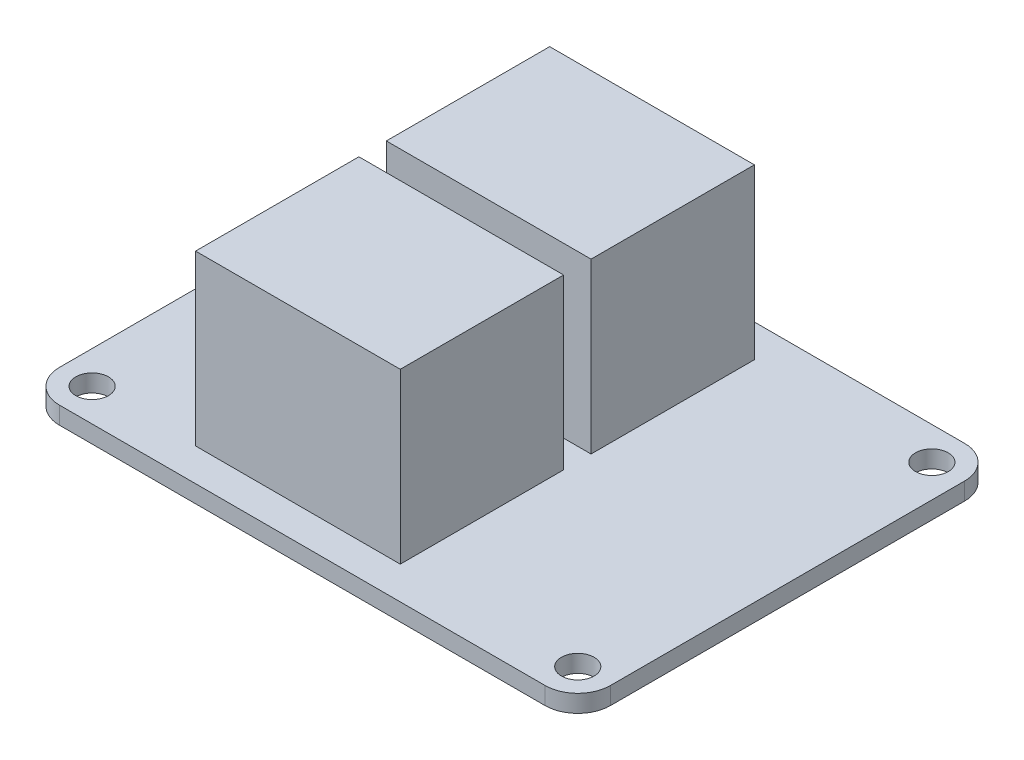
ISO-10303-21;
HEADER;
FILE_DESCRIPTION(('STEP AP214'),'2;1');
FILE_NAME('part.step','',(''),(''),'','','');
FILE_SCHEMA(('AUTOMOTIVE_DESIGN { 1 0 10303 214 1 1 1 1 }'));
ENDSEC;
DATA;
#1=APPLICATION_CONTEXT('core data for automotive mechanical design processes');
#2=APPLICATION_PROTOCOL_DEFINITION('international standard','automotive_design',2000,#1);
#3=PRODUCT_CONTEXT('',#1,'mechanical');
#4=PRODUCT('Part','Part','',(#3));
#5=PRODUCT_RELATED_PRODUCT_CATEGORY('part','',(#4));
#6=PRODUCT_DEFINITION_FORMATION('','',#4);
#7=PRODUCT_DEFINITION_CONTEXT('part definition',#1,'design');
#8=PRODUCT_DEFINITION('design','',#6,#7);
#9=PRODUCT_DEFINITION_SHAPE('','',#8);
#10=(LENGTH_UNIT() NAMED_UNIT(*) SI_UNIT(.MILLI.,.METRE.));
#11=(NAMED_UNIT(*) PLANE_ANGLE_UNIT() SI_UNIT($,.RADIAN.));
#12=(NAMED_UNIT(*) SI_UNIT($,.STERADIAN.) SOLID_ANGLE_UNIT());
#13=UNCERTAINTY_MEASURE_WITH_UNIT(LENGTH_MEASURE(1.E-05),#10,'distance_accuracy_value','');
#14=(GEOMETRIC_REPRESENTATION_CONTEXT(3) GLOBAL_UNCERTAINTY_ASSIGNED_CONTEXT((#13)) GLOBAL_UNIT_ASSIGNED_CONTEXT((#10,
#11,#12)) REPRESENTATION_CONTEXT('',''));
#15=CARTESIAN_POINT('',(0.,0.,0.));
#16=DIRECTION('',(0.,0.,1.));
#17=DIRECTION('',(1.,0.,0.));
#18=AXIS2_PLACEMENT_3D('',#15,#16,#17);
#19=CARTESIAN_POINT('',(0.,1.6,0.));
#20=DIRECTION('',(0.,1.,0.));
#21=DIRECTION('',(0.,0.,1.));
#22=AXIS2_PLACEMENT_3D('',#19,#20,#21);
#23=PLANE('',#22);
#24=DIRECTION('',(1.,0.,0.));
#25=VECTOR('',#24,1.);
#26=CARTESIAN_POINT('',(-21.1899742930591,1.6,2.84601542416452));
#27=LINE('',#26,#25);
#28=CARTESIAN_POINT('',(-21.1899742930591,1.6,2.84601542416452));
#29=VERTEX_POINT('',#28);
#30=CARTESIAN_POINT('',(-2.38997429305913,1.6,2.84601542416452));
#31=VERTEX_POINT('',#30);
#32=EDGE_CURVE('E174',#29,#31,#27,.T.);
#33=ORIENTED_EDGE('',*,*,#32,.F.);
#34=DIRECTION('',(0.,0.,1.));
#35=VECTOR('',#34,1.);
#36=CARTESIAN_POINT('',(-21.1899742930591,1.6,-12.1539845758355));
#37=LINE('',#36,#35);
#38=CARTESIAN_POINT('',(-21.1899742930591,1.6,-12.1539845758355));
#39=VERTEX_POINT('',#38);
#40=EDGE_CURVE('E171',#39,#29,#37,.T.);
#41=ORIENTED_EDGE('',*,*,#40,.F.);
#42=DIRECTION('',(-1.,0.,0.));
#43=VECTOR('',#42,1.);
#44=CARTESIAN_POINT('',(-21.1899742930591,1.6,-12.1539845758355));
#45=LINE('',#44,#43);
#46=CARTESIAN_POINT('',(-2.38997429305913,1.6,-12.1539845758355));
#47=VERTEX_POINT('',#46);
#48=EDGE_CURVE('E183',#47,#39,#45,.T.);
#49=ORIENTED_EDGE('',*,*,#48,.F.);
#50=DIRECTION('',(0.,0.,-1.));
#51=VECTOR('',#50,1.);
#52=CARTESIAN_POINT('',(-2.38997429305913,1.6,-12.1539845758355));
#53=LINE('',#52,#51);
#54=EDGE_CURVE('E191',#31,#47,#53,.T.);
#55=ORIENTED_EDGE('',*,*,#54,.F.);
#56=EDGE_LOOP('',(#33,#41,#49,#55));
#57=FACE_BOUND('',#56,.T.);
#58=CARTESIAN_POINT('',(-30.6899742930591,1.6,20.3660154241645));
#59=DIRECTION('',(0.,1.,0.));
#60=DIRECTION('',(0.,0.,1.));
#61=AXIS2_PLACEMENT_3D('',#58,#59,#60);
#62=CIRCLE('',#61,1.5);
#63=CARTESIAN_POINT('',(-30.6899742930591,1.6,21.8660154241645));
#64=VERTEX_POINT('',#63);
#65=EDGE_CURVE('E209',#64,#64,#62,.T.);
#66=ORIENTED_EDGE('',*,*,#65,.F.);
#67=EDGE_LOOP('',(#66));
#68=FACE_BOUND('',#67,.T.);
#69=CARTESIAN_POINT('',(13.9100257069409,1.6,-12.1539845758355));
#70=DIRECTION('',(0.,1.,0.));
#71=DIRECTION('',(0.,0.,1.));
#72=AXIS2_PLACEMENT_3D('',#69,#70,#71);
#73=CIRCLE('',#72,1.5);
#74=CARTESIAN_POINT('',(13.9100257069409,1.6,-10.6539845758355));
#75=VERTEX_POINT('',#74);
#76=EDGE_CURVE('E221',#75,#75,#73,.T.);
#77=ORIENTED_EDGE('',*,*,#76,.F.);
#78=EDGE_LOOP('',(#77));
#79=FACE_BOUND('',#78,.T.);
#80=DIRECTION('',(1.,0.,0.));
#81=VECTOR('',#80,1.);
#82=CARTESIAN_POINT('',(-33.6899742930591,1.6,23.3660154241645));
#83=LINE('',#82,#81);
#84=CARTESIAN_POINT('',(-30.6899742930591,1.6,23.3660154241645));
#85=VERTEX_POINT('',#84);
#86=CARTESIAN_POINT('',(13.9100257069409,1.6,23.3660154241645));
#87=VERTEX_POINT('',#86);
#88=EDGE_CURVE('E230',#85,#87,#83,.T.);
#89=ORIENTED_EDGE('',*,*,#88,.T.);
#90=CARTESIAN_POINT('',(13.9100257069409,1.6,20.3660154241645));
#91=DIRECTION('',(0.,1.,0.));
#92=DIRECTION('',(0.,0.,1.));
#93=AXIS2_PLACEMENT_3D('',#90,#91,#92);
#94=CIRCLE('',#93,3.);
#95=CARTESIAN_POINT('',(16.9100257069409,1.6,20.3660154241645));
#96=VERTEX_POINT('',#95);
#97=EDGE_CURVE('E11',#87,#96,#94,.T.);
#98=ORIENTED_EDGE('',*,*,#97,.T.);
#99=DIRECTION('',(0.,0.,-1.));
#100=VECTOR('',#99,1.);
#101=CARTESIAN_POINT('',(16.9100257069409,1.6,-15.1539845758355));
#102=LINE('',#101,#100);
#103=CARTESIAN_POINT('',(16.9100257069409,1.6,-12.1539845758355));
#104=VERTEX_POINT('',#103);
#105=EDGE_CURVE('E234',#96,#104,#102,.T.);
#106=ORIENTED_EDGE('',*,*,#105,.T.);
#107=CARTESIAN_POINT('',(13.9100257069409,1.6,-12.1539845758355));
#108=DIRECTION('',(0.,1.,0.));
#109=DIRECTION('',(0.,0.,1.));
#110=AXIS2_PLACEMENT_3D('',#107,#108,#109);
#111=CIRCLE('',#110,3.);
#112=CARTESIAN_POINT('',(13.9100257069409,1.6,-15.1539845758355));
#113=VERTEX_POINT('',#112);
#114=EDGE_CURVE('E257',#104,#113,#111,.T.);
#115=ORIENTED_EDGE('',*,*,#114,.T.);
#116=DIRECTION('',(-1.,0.,0.));
#117=VECTOR('',#116,1.);
#118=CARTESIAN_POINT('',(-33.6899742930591,1.6,-15.1539845758355));
#119=LINE('',#118,#117);
#120=CARTESIAN_POINT('',(-30.6899742930591,1.6,-15.1539845758355));
#121=VERTEX_POINT('',#120);
#122=EDGE_CURVE('E236',#113,#121,#119,.T.);
#123=ORIENTED_EDGE('',*,*,#122,.T.);
#124=CARTESIAN_POINT('',(-30.6899742930591,1.6,-12.1539845758355));
#125=DIRECTION('',(0.,1.,0.));
#126=DIRECTION('',(0.,0.,1.));
#127=AXIS2_PLACEMENT_3D('',#124,#125,#126);
#128=CIRCLE('',#127,3.);
#129=CARTESIAN_POINT('',(-33.6899742930591,1.6,-12.1539845758355));
#130=VERTEX_POINT('',#129);
#131=EDGE_CURVE('E266',#121,#130,#128,.T.);
#132=ORIENTED_EDGE('',*,*,#131,.T.);
#133=DIRECTION('',(0.,0.,1.));
#134=VECTOR('',#133,1.);
#135=CARTESIAN_POINT('',(-33.6899742930591,1.6,-15.1539845758355));
#136=LINE('',#135,#134);
#137=CARTESIAN_POINT('',(-33.6899742930591,1.6,20.3660154241645));
#138=VERTEX_POINT('',#137);
#139=EDGE_CURVE('E227',#130,#138,#136,.T.);
#140=ORIENTED_EDGE('',*,*,#139,.T.);
#141=CARTESIAN_POINT('',(-30.6899742930591,1.6,20.3660154241645));
#142=DIRECTION('',(0.,1.,0.));
#143=DIRECTION('',(0.,0.,1.));
#144=AXIS2_PLACEMENT_3D('',#141,#142,#143);
#145=CIRCLE('',#144,3.);
#146=EDGE_CURVE('E275',#138,#85,#145,.T.);
#147=ORIENTED_EDGE('',*,*,#146,.T.);
#148=EDGE_LOOP('',(#89,#98,#106,#115,#123,#132,#140,#147));
#149=FACE_BOUND('',#148,.T.);
#150=CARTESIAN_POINT('',(13.9100257069409,1.6,20.3660154241645));
#151=DIRECTION('',(0.,1.,0.));
#152=DIRECTION('',(0.,0.,1.));
#153=AXIS2_PLACEMENT_3D('',#150,#151,#152);
#154=CIRCLE('',#153,1.5);
#155=CARTESIAN_POINT('',(13.9100257069409,1.6,21.8660154241645));
#156=VERTEX_POINT('',#155);
#157=EDGE_CURVE('E215',#156,#156,#154,.T.);
#158=ORIENTED_EDGE('',*,*,#157,.F.);
#159=EDGE_LOOP('',(#158));
#160=FACE_BOUND('',#159,.T.);
#161=CARTESIAN_POINT('',(-30.6899742930591,1.6,-12.1539845758355));
#162=DIRECTION('',(0.,1.,0.));
#163=DIRECTION('',(0.,0.,1.));
#164=AXIS2_PLACEMENT_3D('',#161,#162,#163);
#165=CIRCLE('',#164,1.5);
#166=CARTESIAN_POINT('',(-30.6899742930591,1.6,-10.6539845758355));
#167=VERTEX_POINT('',#166);
#168=EDGE_CURVE('E203',#167,#167,#165,.T.);
#169=ORIENTED_EDGE('',*,*,#168,.F.);
#170=EDGE_LOOP('',(#169));
#171=FACE_BOUND('',#170,.T.);
#172=DIRECTION('',(1.,0.,0.));
#173=VECTOR('',#172,1.);
#174=CARTESIAN_POINT('',(-21.1899742930591,1.6,20.3660154241645));
#175=LINE('',#174,#173);
#176=CARTESIAN_POINT('',(-21.1899742930591,1.6,20.3660154241645));
#177=VERTEX_POINT('',#176);
#178=CARTESIAN_POINT('',(-2.38997429305913,1.6,20.3660154241645));
#179=VERTEX_POINT('',#178);
#180=EDGE_CURVE('E382',#177,#179,#175,.T.);
#181=ORIENTED_EDGE('',*,*,#180,.F.);
#182=DIRECTION('',(0.,0.,1.));
#183=VECTOR('',#182,1.);
#184=CARTESIAN_POINT('',(-21.1899742930591,1.6,5.36601542416453));
#185=LINE('',#184,#183);
#186=CARTESIAN_POINT('',(-21.1899742930591,1.6,5.36601542416453));
#187=VERTEX_POINT('',#186);
#188=EDGE_CURVE('E169',#187,#177,#185,.T.);
#189=ORIENTED_EDGE('',*,*,#188,.F.);
#190=DIRECTION('',(-1.,0.,0.));
#191=VECTOR('',#190,1.);
#192=CARTESIAN_POINT('',(-21.1899742930591,1.6,5.36601542416453));
#193=LINE('',#192,#191);
#194=CARTESIAN_POINT('',(-2.38997429305913,1.6,5.36601542416453));
#195=VERTEX_POINT('',#194);
#196=EDGE_CURVE('E165',#195,#187,#193,.T.);
#197=ORIENTED_EDGE('',*,*,#196,.F.);
#198=DIRECTION('',(0.,0.,-1.));
#199=VECTOR('',#198,1.);
#200=CARTESIAN_POINT('',(-2.38997429305913,1.6,5.36601542416453));
#201=LINE('',#200,#199);
#202=EDGE_CURVE('E384',#179,#195,#201,.T.);
#203=ORIENTED_EDGE('',*,*,#202,.F.);
#204=EDGE_LOOP('',(#181,#189,#197,#203));
#205=FACE_BOUND('',#204,.T.);
#206=ADVANCED_FACE('F33',(#57,#68,#79,#149,#160,#171,#205),#23,.T.);
#207=CARTESIAN_POINT('',(0.,0.,0.));
#208=DIRECTION('',(0.,1.,0.));
#209=DIRECTION('',(0.,0.,1.));
#210=AXIS2_PLACEMENT_3D('',#207,#208,#209);
#211=PLANE('',#210);
#212=CARTESIAN_POINT('',(-30.6899742930591,0.,20.3660154241645));
#213=DIRECTION('',(0.,1.,0.));
#214=DIRECTION('',(0.,0.,1.));
#215=AXIS2_PLACEMENT_3D('',#212,#213,#214);
#216=CIRCLE('',#215,1.5);
#217=CARTESIAN_POINT('',(-30.6899742930591,0.,21.8660154241645));
#218=VERTEX_POINT('',#217);
#219=EDGE_CURVE('E206',#218,#218,#216,.T.);
#220=ORIENTED_EDGE('',*,*,#219,.T.);
#221=EDGE_LOOP('',(#220));
#222=FACE_BOUND('',#221,.T.);
#223=CARTESIAN_POINT('',(13.9100257069409,0.,-12.1539845758355));
#224=DIRECTION('',(0.,1.,0.));
#225=DIRECTION('',(0.,0.,1.));
#226=AXIS2_PLACEMENT_3D('',#223,#224,#225);
#227=CIRCLE('',#226,1.5);
#228=CARTESIAN_POINT('',(13.9100257069409,0.,-10.6539845758355));
#229=VERTEX_POINT('',#228);
#230=EDGE_CURVE('E218',#229,#229,#227,.T.);
#231=ORIENTED_EDGE('',*,*,#230,.T.);
#232=EDGE_LOOP('',(#231));
#233=FACE_BOUND('',#232,.T.);
#234=DIRECTION('',(0.,0.,-1.));
#235=VECTOR('',#234,1.);
#236=CARTESIAN_POINT('',(16.9100257069409,0.,-15.1539845758355));
#237=LINE('',#236,#235);
#238=CARTESIAN_POINT('',(16.9100257069409,0.,20.3660154241645));
#239=VERTEX_POINT('',#238);
#240=CARTESIAN_POINT('',(16.9100257069409,0.,-12.1539845758355));
#241=VERTEX_POINT('',#240);
#242=EDGE_CURVE('E245',#239,#241,#237,.T.);
#243=ORIENTED_EDGE('',*,*,#242,.F.);
#244=CARTESIAN_POINT('',(13.9100257069409,0.,20.3660154241645));
#245=DIRECTION('',(0.,1.,0.));
#246=DIRECTION('',(0.,0.,1.));
#247=AXIS2_PLACEMENT_3D('',#244,#245,#246);
#248=CIRCLE('',#247,3.);
#249=CARTESIAN_POINT('',(13.9100257069409,0.,23.3660154241645));
#250=VERTEX_POINT('',#249);
#251=EDGE_CURVE('E280',#239,#250,#248,.F.);
#252=ORIENTED_EDGE('',*,*,#251,.T.);
#253=DIRECTION('',(1.,0.,0.));
#254=VECTOR('',#253,1.);
#255=CARTESIAN_POINT('',(-33.6899742930591,0.,23.3660154241645));
#256=LINE('',#255,#254);
#257=CARTESIAN_POINT('',(-30.6899742930591,0.,23.3660154241645));
#258=VERTEX_POINT('',#257);
#259=EDGE_CURVE('E242',#258,#250,#256,.T.);
#260=ORIENTED_EDGE('',*,*,#259,.F.);
#261=CARTESIAN_POINT('',(-30.6899742930591,0.,20.3660154241645));
#262=DIRECTION('',(0.,1.,0.));
#263=DIRECTION('',(0.,0.,1.));
#264=AXIS2_PLACEMENT_3D('',#261,#262,#263);
#265=CIRCLE('',#264,3.);
#266=CARTESIAN_POINT('',(-33.6899742930591,0.,20.3660154241645));
#267=VERTEX_POINT('',#266);
#268=EDGE_CURVE('E271',#258,#267,#265,.F.);
#269=ORIENTED_EDGE('',*,*,#268,.T.);
#270=DIRECTION('',(0.,0.,1.));
#271=VECTOR('',#270,1.);
#272=CARTESIAN_POINT('',(-33.6899742930591,0.,-15.1539845758355));
#273=LINE('',#272,#271);
#274=CARTESIAN_POINT('',(-33.6899742930591,0.,-12.1539845758355));
#275=VERTEX_POINT('',#274);
#276=EDGE_CURVE('E224',#275,#267,#273,.T.);
#277=ORIENTED_EDGE('',*,*,#276,.F.);
#278=CARTESIAN_POINT('',(-30.6899742930591,0.,-12.1539845758355));
#279=DIRECTION('',(0.,1.,0.));
#280=DIRECTION('',(0.,0.,1.));
#281=AXIS2_PLACEMENT_3D('',#278,#279,#280);
#282=CIRCLE('',#281,3.);
#283=CARTESIAN_POINT('',(-30.6899742930591,0.,-15.1539845758355));
#284=VERTEX_POINT('',#283);
#285=EDGE_CURVE('E262',#275,#284,#282,.F.);
#286=ORIENTED_EDGE('',*,*,#285,.T.);
#287=DIRECTION('',(-1.,0.,0.));
#288=VECTOR('',#287,1.);
#289=CARTESIAN_POINT('',(-33.6899742930591,0.,-15.1539845758355));
#290=LINE('',#289,#288);
#291=CARTESIAN_POINT('',(13.9100257069409,0.,-15.1539845758355));
#292=VERTEX_POINT('',#291);
#293=EDGE_CURVE('E231',#292,#284,#290,.T.);
#294=ORIENTED_EDGE('',*,*,#293,.F.);
#295=CARTESIAN_POINT('',(13.9100257069409,0.,-12.1539845758355));
#296=DIRECTION('',(0.,1.,0.));
#297=DIRECTION('',(0.,0.,1.));
#298=AXIS2_PLACEMENT_3D('',#295,#296,#297);
#299=CIRCLE('',#298,3.);
#300=EDGE_CURVE('E251',#292,#241,#299,.F.);
#301=ORIENTED_EDGE('',*,*,#300,.T.);
#302=EDGE_LOOP('',(#243,#252,#260,#269,#277,#286,#294,#301));
#303=FACE_BOUND('',#302,.T.);
#304=CARTESIAN_POINT('',(13.9100257069409,0.,20.3660154241645));
#305=DIRECTION('',(0.,1.,0.));
#306=DIRECTION('',(0.,0.,1.));
#307=AXIS2_PLACEMENT_3D('',#304,#305,#306);
#308=CIRCLE('',#307,1.5);
#309=CARTESIAN_POINT('',(13.9100257069409,0.,21.8660154241645));
#310=VERTEX_POINT('',#309);
#311=EDGE_CURVE('E212',#310,#310,#308,.T.);
#312=ORIENTED_EDGE('',*,*,#311,.T.);
#313=EDGE_LOOP('',(#312));
#314=FACE_BOUND('',#313,.T.);
#315=CARTESIAN_POINT('',(-30.6899742930591,0.,-12.1539845758355));
#316=DIRECTION('',(0.,1.,0.));
#317=DIRECTION('',(0.,0.,1.));
#318=AXIS2_PLACEMENT_3D('',#315,#316,#317);
#319=CIRCLE('',#318,1.5);
#320=CARTESIAN_POINT('',(-30.6899742930591,0.,-10.6539845758355));
#321=VERTEX_POINT('',#320);
#322=EDGE_CURVE('E202',#321,#321,#319,.T.);
#323=ORIENTED_EDGE('',*,*,#322,.T.);
#324=EDGE_LOOP('',(#323));
#325=FACE_BOUND('',#324,.T.);
#326=ADVANCED_FACE('F298',(#222,#233,#303,#314,#325),#211,.F.);
#327=CARTESIAN_POINT('',(-33.6899742930591,1.6,-15.1539845758355));
#328=DIRECTION('',(1.,0.,0.));
#329=DIRECTION('',(0.,0.,-1.));
#330=AXIS2_PLACEMENT_3D('',#327,#328,#329);
#331=PLANE('',#330);
#332=ORIENTED_EDGE('',*,*,#276,.T.);
#333=DIRECTION('',(0.,-1.,0.));
#334=VECTOR('',#333,1.);
#335=CARTESIAN_POINT('',(-33.6899742930591,1.6,20.3660154241645));
#336=LINE('',#335,#334);
#337=EDGE_CURVE('E273',#267,#138,#336,.F.);
#338=ORIENTED_EDGE('',*,*,#337,.T.);
#339=ORIENTED_EDGE('',*,*,#139,.F.);
#340=DIRECTION('',(0.,-1.,0.));
#341=VECTOR('',#340,1.);
#342=CARTESIAN_POINT('',(-33.6899742930591,1.6,-12.1539845758355));
#343=LINE('',#342,#341);
#344=EDGE_CURVE('E259',#130,#275,#343,.T.);
#345=ORIENTED_EDGE('',*,*,#344,.T.);
#346=EDGE_LOOP('',(#332,#338,#339,#345));
#347=FACE_BOUND('',#346,.T.);
#348=ADVANCED_FACE('F316',(#347),#331,.F.);
#349=CARTESIAN_POINT('',(-33.6899742930591,1.6,23.3660154241645));
#350=DIRECTION('',(0.,0.,-1.));
#351=DIRECTION('',(-1.,0.,0.));
#352=AXIS2_PLACEMENT_3D('',#349,#350,#351);
#353=PLANE('',#352);
#354=ORIENTED_EDGE('',*,*,#259,.T.);
#355=DIRECTION('',(0.,-1.,0.));
#356=VECTOR('',#355,1.);
#357=CARTESIAN_POINT('',(13.9100257069409,1.6,23.3660154241645));
#358=LINE('',#357,#356);
#359=EDGE_CURVE('E41',#250,#87,#358,.F.);
#360=ORIENTED_EDGE('',*,*,#359,.T.);
#361=ORIENTED_EDGE('',*,*,#88,.F.);
#362=DIRECTION('',(0.,-1.,0.));
#363=VECTOR('',#362,1.);
#364=CARTESIAN_POINT('',(-30.6899742930591,1.6,23.3660154241645));
#365=LINE('',#364,#363);
#366=EDGE_CURVE('E268',#85,#258,#365,.T.);
#367=ORIENTED_EDGE('',*,*,#366,.T.);
#368=EDGE_LOOP('',(#354,#360,#361,#367));
#369=FACE_BOUND('',#368,.T.);
#370=ADVANCED_FACE('F284',(#369),#353,.F.);
#371=CARTESIAN_POINT('',(16.9100257069409,1.6,-15.1539845758355));
#372=DIRECTION('',(-1.,0.,0.));
#373=DIRECTION('',(0.,0.,1.));
#374=AXIS2_PLACEMENT_3D('',#371,#372,#373);
#375=PLANE('',#374);
#376=ORIENTED_EDGE('',*,*,#105,.F.);
#377=DIRECTION('',(0.,-1.,0.));
#378=VECTOR('',#377,1.);
#379=CARTESIAN_POINT('',(16.9100257069409,1.6,20.3660154241645));
#380=LINE('',#379,#378);
#381=EDGE_CURVE('E277',#96,#239,#380,.T.);
#382=ORIENTED_EDGE('',*,*,#381,.T.);
#383=ORIENTED_EDGE('',*,*,#242,.T.);
#384=DIRECTION('',(0.,-1.,0.));
#385=VECTOR('',#384,1.);
#386=CARTESIAN_POINT('',(16.9100257069409,1.6,-12.1539845758355));
#387=LINE('',#386,#385);
#388=EDGE_CURVE('E254',#241,#104,#387,.F.);
#389=ORIENTED_EDGE('',*,*,#388,.T.);
#390=EDGE_LOOP('',(#376,#382,#383,#389));
#391=FACE_BOUND('',#390,.T.);
#392=ADVANCED_FACE('F296',(#391),#375,.F.);
#393=CARTESIAN_POINT('',(-33.6899742930591,1.6,-15.1539845758355));
#394=DIRECTION('',(0.,0.,1.));
#395=DIRECTION('',(1.,0.,0.));
#396=AXIS2_PLACEMENT_3D('',#393,#394,#395);
#397=PLANE('',#396);
#398=ORIENTED_EDGE('',*,*,#293,.T.);
#399=DIRECTION('',(0.,-1.,0.));
#400=VECTOR('',#399,1.);
#401=CARTESIAN_POINT('',(-30.6899742930591,1.6,-15.1539845758355));
#402=LINE('',#401,#400);
#403=EDGE_CURVE('E264',#284,#121,#402,.F.);
#404=ORIENTED_EDGE('',*,*,#403,.T.);
#405=ORIENTED_EDGE('',*,*,#122,.F.);
#406=DIRECTION('',(0.,-1.,0.));
#407=VECTOR('',#406,1.);
#408=CARTESIAN_POINT('',(13.9100257069409,1.6,-15.1539845758355));
#409=LINE('',#408,#407);
#410=EDGE_CURVE('E239',#113,#292,#409,.T.);
#411=ORIENTED_EDGE('',*,*,#410,.T.);
#412=EDGE_LOOP('',(#398,#404,#405,#411));
#413=FACE_BOUND('',#412,.T.);
#414=ADVANCED_FACE('F309',(#413),#397,.F.);
#415=CARTESIAN_POINT('',(13.9100257069409,1.6,-12.1539845758355));
#416=DIRECTION('',(0.,-1.,0.));
#417=DIRECTION('',(0.,0.,-1.));
#418=AXIS2_PLACEMENT_3D('',#415,#416,#417);
#419=CYLINDRICAL_SURFACE('',#418,1.5);
#420=ORIENTED_EDGE('',*,*,#76,.T.);
#421=EDGE_LOOP('',(#420));
#422=FACE_BOUND('',#421,.T.);
#423=ORIENTED_EDGE('',*,*,#230,.F.);
#424=EDGE_LOOP('',(#423));
#425=FACE_BOUND('',#424,.T.);
#426=ADVANCED_FACE('F339',(#422,#425),#419,.F.);
#427=CARTESIAN_POINT('',(13.9100257069409,1.6,20.3660154241645));
#428=DIRECTION('',(0.,-1.,0.));
#429=DIRECTION('',(0.,0.,-1.));
#430=AXIS2_PLACEMENT_3D('',#427,#428,#429);
#431=CYLINDRICAL_SURFACE('',#430,1.5);
#432=ORIENTED_EDGE('',*,*,#157,.T.);
#433=EDGE_LOOP('',(#432));
#434=FACE_BOUND('',#433,.T.);
#435=ORIENTED_EDGE('',*,*,#311,.F.);
#436=EDGE_LOOP('',(#435));
#437=FACE_BOUND('',#436,.T.);
#438=ADVANCED_FACE('F361',(#434,#437),#431,.F.);
#439=CARTESIAN_POINT('',(-30.6899742930591,1.6,20.3660154241645));
#440=DIRECTION('',(0.,-1.,0.));
#441=DIRECTION('',(0.,0.,-1.));
#442=AXIS2_PLACEMENT_3D('',#439,#440,#441);
#443=CYLINDRICAL_SURFACE('',#442,1.5);
#444=ORIENTED_EDGE('',*,*,#65,.T.);
#445=EDGE_LOOP('',(#444));
#446=FACE_BOUND('',#445,.T.);
#447=ORIENTED_EDGE('',*,*,#219,.F.);
#448=EDGE_LOOP('',(#447));
#449=FACE_BOUND('',#448,.T.);
#450=ADVANCED_FACE('F355',(#446,#449),#443,.F.);
#451=CARTESIAN_POINT('',(-30.6899742930591,1.6,-12.1539845758355));
#452=DIRECTION('',(0.,-1.,0.));
#453=DIRECTION('',(0.,0.,-1.));
#454=AXIS2_PLACEMENT_3D('',#451,#452,#453);
#455=CYLINDRICAL_SURFACE('',#454,1.5);
#456=ORIENTED_EDGE('',*,*,#168,.T.);
#457=EDGE_LOOP('',(#456));
#458=FACE_BOUND('',#457,.T.);
#459=ORIENTED_EDGE('',*,*,#322,.F.);
#460=EDGE_LOOP('',(#459));
#461=FACE_BOUND('',#460,.T.);
#462=ADVANCED_FACE('F351',(#458,#461),#455,.F.);
#463=CARTESIAN_POINT('',(13.9100257069409,1.6,-12.1539845758355));
#464=DIRECTION('',(0.,-1.,0.));
#465=DIRECTION('',(0.,0.,-1.));
#466=AXIS2_PLACEMENT_3D('',#463,#464,#465);
#467=CYLINDRICAL_SURFACE('',#466,3.);
#468=ORIENTED_EDGE('',*,*,#114,.F.);
#469=ORIENTED_EDGE('',*,*,#388,.F.);
#470=ORIENTED_EDGE('',*,*,#300,.F.);
#471=ORIENTED_EDGE('',*,*,#410,.F.);
#472=EDGE_LOOP('',(#468,#469,#470,#471));
#473=FACE_BOUND('',#472,.T.);
#474=ADVANCED_FACE('F305',(#473),#467,.T.);
#475=CARTESIAN_POINT('',(-30.6899742930591,1.6,-12.1539845758355));
#476=DIRECTION('',(0.,-1.,0.));
#477=DIRECTION('',(0.,0.,-1.));
#478=AXIS2_PLACEMENT_3D('',#475,#476,#477);
#479=CYLINDRICAL_SURFACE('',#478,3.);
#480=ORIENTED_EDGE('',*,*,#131,.F.);
#481=ORIENTED_EDGE('',*,*,#403,.F.);
#482=ORIENTED_EDGE('',*,*,#285,.F.);
#483=ORIENTED_EDGE('',*,*,#344,.F.);
#484=EDGE_LOOP('',(#480,#481,#482,#483));
#485=FACE_BOUND('',#484,.T.);
#486=ADVANCED_FACE('F312',(#485),#479,.T.);
#487=CARTESIAN_POINT('',(-30.6899742930591,1.6,20.3660154241645));
#488=DIRECTION('',(0.,-1.,0.));
#489=DIRECTION('',(0.,0.,-1.));
#490=AXIS2_PLACEMENT_3D('',#487,#488,#489);
#491=CYLINDRICAL_SURFACE('',#490,3.);
#492=ORIENTED_EDGE('',*,*,#146,.F.);
#493=ORIENTED_EDGE('',*,*,#337,.F.);
#494=ORIENTED_EDGE('',*,*,#268,.F.);
#495=ORIENTED_EDGE('',*,*,#366,.F.);
#496=EDGE_LOOP('',(#492,#493,#494,#495));
#497=FACE_BOUND('',#496,.T.);
#498=ADVANCED_FACE('F320',(#497),#491,.T.);
#499=CARTESIAN_POINT('',(13.9100257069409,1.6,20.3660154241645));
#500=DIRECTION('',(0.,-1.,0.));
#501=DIRECTION('',(0.,0.,-1.));
#502=AXIS2_PLACEMENT_3D('',#499,#500,#501);
#503=CYLINDRICAL_SURFACE('',#502,3.);
#504=ORIENTED_EDGE('',*,*,#97,.F.);
#505=ORIENTED_EDGE('',*,*,#359,.F.);
#506=ORIENTED_EDGE('',*,*,#251,.F.);
#507=ORIENTED_EDGE('',*,*,#381,.F.);
#508=EDGE_LOOP('',(#504,#505,#506,#507));
#509=FACE_BOUND('',#508,.T.);
#510=ADVANCED_FACE('F35',(#509),#503,.T.);
#511=CARTESIAN_POINT('',(-21.1899742930591,17.1,-12.1539845758355));
#512=DIRECTION('',(1.,0.,0.));
#513=DIRECTION('',(0.,0.,-1.));
#514=AXIS2_PLACEMENT_3D('',#511,#512,#513);
#515=PLANE('',#514);
#516=ORIENTED_EDGE('',*,*,#40,.T.);
#517=DIRECTION('',(0.,-1.,0.));
#518=VECTOR('',#517,1.);
#519=CARTESIAN_POINT('',(-21.1899742930591,17.1,2.84601542416452));
#520=LINE('',#519,#518);
#521=CARTESIAN_POINT('',(-21.1899742930591,17.1,2.84601542416452));
#522=VERTEX_POINT('',#521);
#523=EDGE_CURVE('E200',#522,#29,#520,.T.);
#524=ORIENTED_EDGE('',*,*,#523,.F.);
#525=DIRECTION('',(0.,0.,1.));
#526=VECTOR('',#525,1.);
#527=CARTESIAN_POINT('',(-21.1899742930591,17.1,-12.1539845758355));
#528=LINE('',#527,#526);
#529=CARTESIAN_POINT('',(-21.1899742930591,17.1,-12.1539845758355));
#530=VERTEX_POINT('',#529);
#531=EDGE_CURVE('E179',#530,#522,#528,.T.);
#532=ORIENTED_EDGE('',*,*,#531,.F.);
#533=DIRECTION('',(0.,-1.,0.));
#534=VECTOR('',#533,1.);
#535=CARTESIAN_POINT('',(-21.1899742930591,17.1,-12.1539845758355));
#536=LINE('',#535,#534);
#537=EDGE_CURVE('E188',#530,#39,#536,.T.);
#538=ORIENTED_EDGE('',*,*,#537,.T.);
#539=EDGE_LOOP('',(#516,#524,#532,#538));
#540=FACE_BOUND('',#539,.T.);
#541=ADVANCED_FACE('F326',(#540),#515,.F.);
#542=CARTESIAN_POINT('',(-21.1899742930591,17.1,2.84601542416452));
#543=DIRECTION('',(0.,0.,-1.));
#544=DIRECTION('',(-1.,0.,0.));
#545=AXIS2_PLACEMENT_3D('',#542,#543,#544);
#546=PLANE('',#545);
#547=ORIENTED_EDGE('',*,*,#32,.T.);
#548=DIRECTION('',(0.,-1.,0.));
#549=VECTOR('',#548,1.);
#550=CARTESIAN_POINT('',(-2.38997429305913,17.1,2.84601542416452));
#551=LINE('',#550,#549);
#552=CARTESIAN_POINT('',(-2.38997429305913,17.1,2.84601542416452));
#553=VERTEX_POINT('',#552);
#554=EDGE_CURVE('E197',#553,#31,#551,.T.);
#555=ORIENTED_EDGE('',*,*,#554,.F.);
#556=DIRECTION('',(1.,0.,0.));
#557=VECTOR('',#556,1.);
#558=CARTESIAN_POINT('',(-21.1899742930591,17.1,2.84601542416452));
#559=LINE('',#558,#557);
#560=EDGE_CURVE('E182',#522,#553,#559,.T.);
#561=ORIENTED_EDGE('',*,*,#560,.F.);
#562=ORIENTED_EDGE('',*,*,#523,.T.);
#563=EDGE_LOOP('',(#547,#555,#561,#562));
#564=FACE_BOUND('',#563,.T.);
#565=ADVANCED_FACE('F418',(#564),#546,.F.);
#566=CARTESIAN_POINT('',(-2.38997429305913,17.1,-12.1539845758355));
#567=DIRECTION('',(-1.,0.,0.));
#568=DIRECTION('',(0.,0.,1.));
#569=AXIS2_PLACEMENT_3D('',#566,#567,#568);
#570=PLANE('',#569);
#571=ORIENTED_EDGE('',*,*,#54,.T.);
#572=DIRECTION('',(0.,-1.,0.));
#573=VECTOR('',#572,1.);
#574=CARTESIAN_POINT('',(-2.38997429305913,17.1,-12.1539845758355));
#575=LINE('',#574,#573);
#576=CARTESIAN_POINT('',(-2.38997429305913,17.1,-12.1539845758355));
#577=VERTEX_POINT('',#576);
#578=EDGE_CURVE('E56',#577,#47,#575,.T.);
#579=ORIENTED_EDGE('',*,*,#578,.F.);
#580=DIRECTION('',(0.,0.,-1.));
#581=VECTOR('',#580,1.);
#582=CARTESIAN_POINT('',(-2.38997429305913,17.1,-12.1539845758355));
#583=LINE('',#582,#581);
#584=EDGE_CURVE('E185',#553,#577,#583,.T.);
#585=ORIENTED_EDGE('',*,*,#584,.F.);
#586=ORIENTED_EDGE('',*,*,#554,.T.);
#587=EDGE_LOOP('',(#571,#579,#585,#586));
#588=FACE_BOUND('',#587,.T.);
#589=ADVANCED_FACE('F416',(#588),#570,.F.);
#590=CARTESIAN_POINT('',(-21.1899742930591,17.1,-12.1539845758355));
#591=DIRECTION('',(0.,0.,1.));
#592=DIRECTION('',(1.,0.,0.));
#593=AXIS2_PLACEMENT_3D('',#590,#591,#592);
#594=PLANE('',#593);
#595=ORIENTED_EDGE('',*,*,#48,.T.);
#596=ORIENTED_EDGE('',*,*,#537,.F.);
#597=DIRECTION('',(-1.,0.,0.));
#598=VECTOR('',#597,1.);
#599=CARTESIAN_POINT('',(-21.1899742930591,17.1,-12.1539845758355));
#600=LINE('',#599,#598);
#601=EDGE_CURVE('E187',#577,#530,#600,.T.);
#602=ORIENTED_EDGE('',*,*,#601,.F.);
#603=ORIENTED_EDGE('',*,*,#578,.T.);
#604=EDGE_LOOP('',(#595,#596,#602,#603));
#605=FACE_BOUND('',#604,.T.);
#606=ADVANCED_FACE('F412',(#605),#594,.F.);
#607=CARTESIAN_POINT('',(0.,17.1,0.));
#608=DIRECTION('',(0.,1.,0.));
#609=DIRECTION('',(0.,0.,1.));
#610=AXIS2_PLACEMENT_3D('',#607,#608,#609);
#611=PLANE('',#610);
#612=ORIENTED_EDGE('',*,*,#531,.T.);
#613=ORIENTED_EDGE('',*,*,#560,.T.);
#614=ORIENTED_EDGE('',*,*,#584,.T.);
#615=ORIENTED_EDGE('',*,*,#601,.T.);
#616=EDGE_LOOP('',(#612,#613,#614,#615));
#617=FACE_BOUND('',#616,.T.);
#618=ADVANCED_FACE('F409',(#617),#611,.T.);
#619=CARTESIAN_POINT('',(-21.1899742930591,17.1,5.36601542416453));
#620=DIRECTION('',(1.,0.,0.));
#621=DIRECTION('',(0.,0.,-1.));
#622=AXIS2_PLACEMENT_3D('',#619,#620,#621);
#623=PLANE('',#622);
#624=ORIENTED_EDGE('',*,*,#188,.T.);
#625=DIRECTION('',(0.,-1.,0.));
#626=VECTOR('',#625,1.);
#627=CARTESIAN_POINT('',(-21.1899742930591,17.1,20.3660154241645));
#628=LINE('',#627,#626);
#629=CARTESIAN_POINT('',(-21.1899742930591,17.1,20.3660154241645));
#630=VERTEX_POINT('',#629);
#631=EDGE_CURVE('E150',#630,#177,#628,.T.);
#632=ORIENTED_EDGE('',*,*,#631,.F.);
#633=DIRECTION('',(0.,0.,1.));
#634=VECTOR('',#633,1.);
#635=CARTESIAN_POINT('',(-21.1899742930591,17.1,5.36601542416453));
#636=LINE('',#635,#634);
#637=CARTESIAN_POINT('',(-21.1899742930591,17.1,5.36601542416453));
#638=VERTEX_POINT('',#637);
#639=EDGE_CURVE('E157',#638,#630,#636,.T.);
#640=ORIENTED_EDGE('',*,*,#639,.F.);
#641=DIRECTION('',(0.,-1.,0.));
#642=VECTOR('',#641,1.);
#643=CARTESIAN_POINT('',(-21.1899742930591,17.1,5.36601542416453));
#644=LINE('',#643,#642);
#645=EDGE_CURVE('E391',#638,#187,#644,.T.);
#646=ORIENTED_EDGE('',*,*,#645,.T.);
#647=EDGE_LOOP('',(#624,#632,#640,#646));
#648=FACE_BOUND('',#647,.T.);
#649=ADVANCED_FACE('F167',(#648),#623,.F.);
#650=CARTESIAN_POINT('',(-21.1899742930591,17.1,20.3660154241645));
#651=DIRECTION('',(0.,0.,-1.));
#652=DIRECTION('',(-1.,0.,0.));
#653=AXIS2_PLACEMENT_3D('',#650,#651,#652);
#654=PLANE('',#653);
#655=ORIENTED_EDGE('',*,*,#180,.T.);
#656=DIRECTION('',(0.,-1.,0.));
#657=VECTOR('',#656,1.);
#658=CARTESIAN_POINT('',(-2.38997429305913,17.1,20.3660154241645));
#659=LINE('',#658,#657);
#660=CARTESIAN_POINT('',(-2.38997429305913,17.1,20.3660154241645));
#661=VERTEX_POINT('',#660);
#662=EDGE_CURVE('E153',#661,#179,#659,.T.);
#663=ORIENTED_EDGE('',*,*,#662,.F.);
#664=DIRECTION('',(1.,0.,0.));
#665=VECTOR('',#664,1.);
#666=CARTESIAN_POINT('',(-21.1899742930591,17.1,20.3660154241645));
#667=LINE('',#666,#665);
#668=EDGE_CURVE('E146',#630,#661,#667,.T.);
#669=ORIENTED_EDGE('',*,*,#668,.F.);
#670=ORIENTED_EDGE('',*,*,#631,.T.);
#671=EDGE_LOOP('',(#655,#663,#669,#670));
#672=FACE_BOUND('',#671,.T.);
#673=ADVANCED_FACE('F148',(#672),#654,.F.);
#674=CARTESIAN_POINT('',(-2.38997429305913,17.1,5.36601542416453));
#675=DIRECTION('',(-1.,0.,0.));
#676=DIRECTION('',(0.,0.,1.));
#677=AXIS2_PLACEMENT_3D('',#674,#675,#676);
#678=PLANE('',#677);
#679=ORIENTED_EDGE('',*,*,#202,.T.);
#680=DIRECTION('',(0.,-1.,0.));
#681=VECTOR('',#680,1.);
#682=CARTESIAN_POINT('',(-2.38997429305913,17.1,5.36601542416453));
#683=LINE('',#682,#681);
#684=CARTESIAN_POINT('',(-2.38997429305913,17.1,5.36601542416453));
#685=VERTEX_POINT('',#684);
#686=EDGE_CURVE('E48',#685,#195,#683,.T.);
#687=ORIENTED_EDGE('',*,*,#686,.F.);
#688=DIRECTION('',(0.,0.,-1.));
#689=VECTOR('',#688,1.);
#690=CARTESIAN_POINT('',(-2.38997429305913,17.1,5.36601542416453));
#691=LINE('',#690,#689);
#692=EDGE_CURVE('E156',#661,#685,#691,.T.);
#693=ORIENTED_EDGE('',*,*,#692,.F.);
#694=ORIENTED_EDGE('',*,*,#662,.T.);
#695=EDGE_LOOP('',(#679,#687,#693,#694));
#696=FACE_BOUND('',#695,.T.);
#697=ADVANCED_FACE('F394',(#696),#678,.F.);
#698=CARTESIAN_POINT('',(-21.1899742930591,17.1,5.36601542416453));
#699=DIRECTION('',(0.,0.,1.));
#700=DIRECTION('',(1.,0.,0.));
#701=AXIS2_PLACEMENT_3D('',#698,#699,#700);
#702=PLANE('',#701);
#703=ORIENTED_EDGE('',*,*,#196,.T.);
#704=ORIENTED_EDGE('',*,*,#645,.F.);
#705=DIRECTION('',(-1.,0.,0.));
#706=VECTOR('',#705,1.);
#707=CARTESIAN_POINT('',(-21.1899742930591,17.1,5.36601542416453));
#708=LINE('',#707,#706);
#709=EDGE_CURVE('E161',#685,#638,#708,.T.);
#710=ORIENTED_EDGE('',*,*,#709,.F.);
#711=ORIENTED_EDGE('',*,*,#686,.T.);
#712=EDGE_LOOP('',(#703,#704,#710,#711));
#713=FACE_BOUND('',#712,.T.);
#714=ADVANCED_FACE('F395',(#713),#702,.F.);
#715=CARTESIAN_POINT('',(0.,17.1,0.));
#716=DIRECTION('',(0.,1.,0.));
#717=DIRECTION('',(0.,0.,1.));
#718=AXIS2_PLACEMENT_3D('',#715,#716,#717);
#719=PLANE('',#718);
#720=ORIENTED_EDGE('',*,*,#639,.T.);
#721=ORIENTED_EDGE('',*,*,#668,.T.);
#722=ORIENTED_EDGE('',*,*,#692,.T.);
#723=ORIENTED_EDGE('',*,*,#709,.T.);
#724=EDGE_LOOP('',(#720,#721,#722,#723));
#725=FACE_BOUND('',#724,.T.);
#726=ADVANCED_FACE('F160',(#725),#719,.T.);
#727=CLOSED_SHELL('',(#206,#326,#348,#370,#392,#414,#426,#438,#450,#462,#474,#486,#498,#510,
#541,#565,#589,#606,#618,#649,#673,#697,#714,#726));
#728=MANIFOLD_SOLID_BREP('B2',#727);
#729=ADVANCED_BREP_SHAPE_REPRESENTATION('',(#18,#728),#14);
#730=SHAPE_DEFINITION_REPRESENTATION(#9,#729);
ENDSEC;
END-ISO-10303-21;
